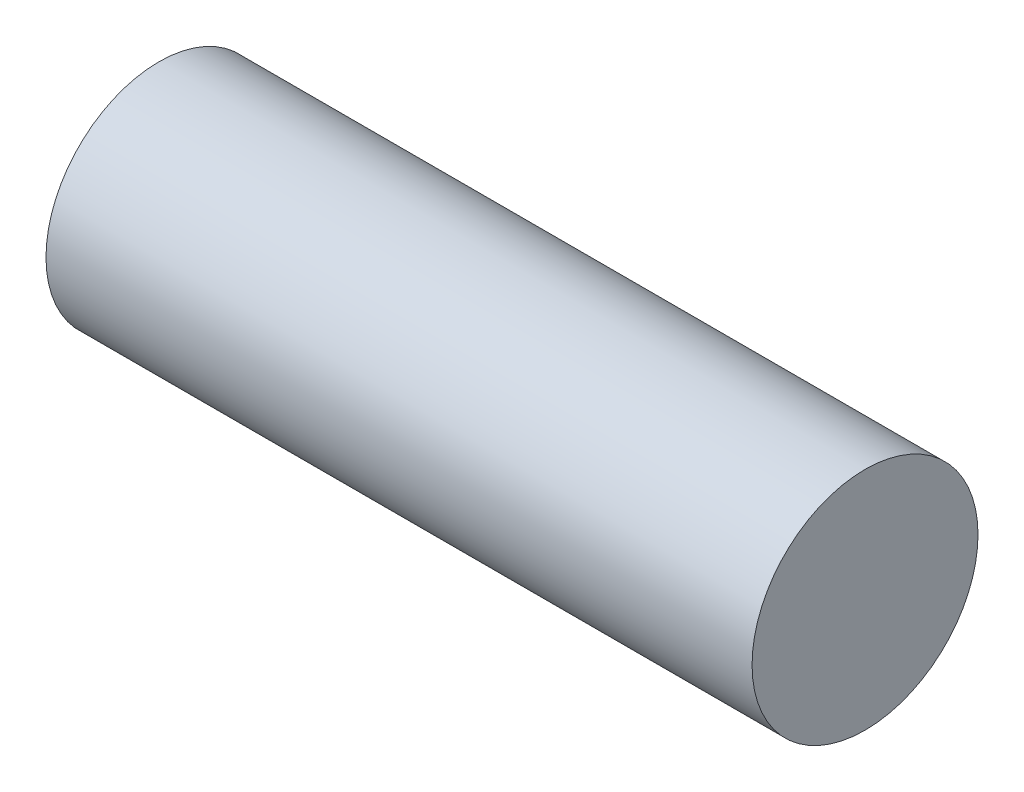
ISO-10303-21;
HEADER;
FILE_DESCRIPTION(('STEP AP214'),'2;1');
FILE_NAME('part.step','',(''),(''),'','','');
FILE_SCHEMA(('AUTOMOTIVE_DESIGN { 1 0 10303 214 1 1 1 1 }'));
ENDSEC;
DATA;
#1=APPLICATION_CONTEXT('core data for automotive mechanical design processes');
#2=APPLICATION_PROTOCOL_DEFINITION('international standard','automotive_design',2000,#1);
#3=PRODUCT_CONTEXT('',#1,'mechanical');
#4=PRODUCT('Part','Part','',(#3));
#5=PRODUCT_RELATED_PRODUCT_CATEGORY('part','',(#4));
#6=PRODUCT_DEFINITION_FORMATION('','',#4);
#7=PRODUCT_DEFINITION_CONTEXT('part definition',#1,'design');
#8=PRODUCT_DEFINITION('design','',#6,#7);
#9=PRODUCT_DEFINITION_SHAPE('','',#8);
#10=(LENGTH_UNIT() NAMED_UNIT(*) SI_UNIT(.MILLI.,.METRE.));
#11=(NAMED_UNIT(*) PLANE_ANGLE_UNIT() SI_UNIT($,.RADIAN.));
#12=(NAMED_UNIT(*) SI_UNIT($,.STERADIAN.) SOLID_ANGLE_UNIT());
#13=UNCERTAINTY_MEASURE_WITH_UNIT(LENGTH_MEASURE(1.E-05),#10,'distance_accuracy_value','');
#14=(GEOMETRIC_REPRESENTATION_CONTEXT(3) GLOBAL_UNCERTAINTY_ASSIGNED_CONTEXT((#13)) GLOBAL_UNIT_ASSIGNED_CONTEXT((#10,
#11,#12)) REPRESENTATION_CONTEXT('',''));
#15=CARTESIAN_POINT('',(0.,0.,0.));
#16=DIRECTION('',(0.,0.,1.));
#17=DIRECTION('',(1.,0.,0.));
#18=AXIS2_PLACEMENT_3D('',#15,#16,#17);
#19=CARTESIAN_POINT('',(340.,0.,0.));
#20=DIRECTION('',(1.,0.,0.));
#21=DIRECTION('',(0.,0.,-1.));
#22=AXIS2_PLACEMENT_3D('',#19,#20,#21);
#23=PLANE('',#22);
#24=CARTESIAN_POINT('',(340.,0.,0.));
#25=DIRECTION('',(1.,0.,0.));
#26=DIRECTION('',(0.,0.,-1.));
#27=AXIS2_PLACEMENT_3D('',#24,#25,#26);
#28=CIRCLE('',#27,40.);
#29=CARTESIAN_POINT('',(340.,0.,-40.));
#30=VERTEX_POINT('',#29);
#31=EDGE_CURVE('E11',#30,#30,#28,.T.);
#32=ORIENTED_EDGE('',*,*,#31,.F.);
#33=EDGE_LOOP('',(#32));
#34=FACE_BOUND('',#33,.T.);
#35=ADVANCED_FACE('F41',(#34),#23,.F.);
#36=CARTESIAN_POINT('',(590.,0.,0.));
#37=DIRECTION('',(1.,0.,0.));
#38=DIRECTION('',(0.,0.,-1.));
#39=AXIS2_PLACEMENT_3D('',#36,#37,#38);
#40=PLANE('',#39);
#41=CARTESIAN_POINT('',(590.,0.,0.));
#42=DIRECTION('',(1.,0.,0.));
#43=DIRECTION('',(0.,0.,-1.));
#44=AXIS2_PLACEMENT_3D('',#41,#42,#43);
#45=CIRCLE('',#44,40.);
#46=CARTESIAN_POINT('',(590.,0.,-40.));
#47=VERTEX_POINT('',#46);
#48=EDGE_CURVE('E50',#47,#47,#45,.T.);
#49=ORIENTED_EDGE('',*,*,#48,.T.);
#50=EDGE_LOOP('',(#49));
#51=FACE_BOUND('',#50,.T.);
#52=ADVANCED_FACE('F75',(#51),#40,.T.);
#53=CARTESIAN_POINT('',(590.,0.,0.));
#54=DIRECTION('',(-1.,0.,0.));
#55=DIRECTION('',(0.,0.,1.));
#56=AXIS2_PLACEMENT_3D('',#53,#54,#55);
#57=CYLINDRICAL_SURFACE('',#56,40.);
#58=ORIENTED_EDGE('',*,*,#31,.T.);
#59=EDGE_LOOP('',(#58));
#60=FACE_BOUND('',#59,.T.);
#61=ORIENTED_EDGE('',*,*,#48,.F.);
#62=EDGE_LOOP('',(#61));
#63=FACE_BOUND('',#62,.T.);
#64=ADVANCED_FACE('F83',(#60,#63),#57,.T.);
#65=CLOSED_SHELL('',(#35,#52,#64));
#66=MANIFOLD_SOLID_BREP('B2',#65);
#67=ADVANCED_BREP_SHAPE_REPRESENTATION('',(#18,#66),#14);
#68=SHAPE_DEFINITION_REPRESENTATION(#9,#67);
ENDSEC;
END-ISO-10303-21;
